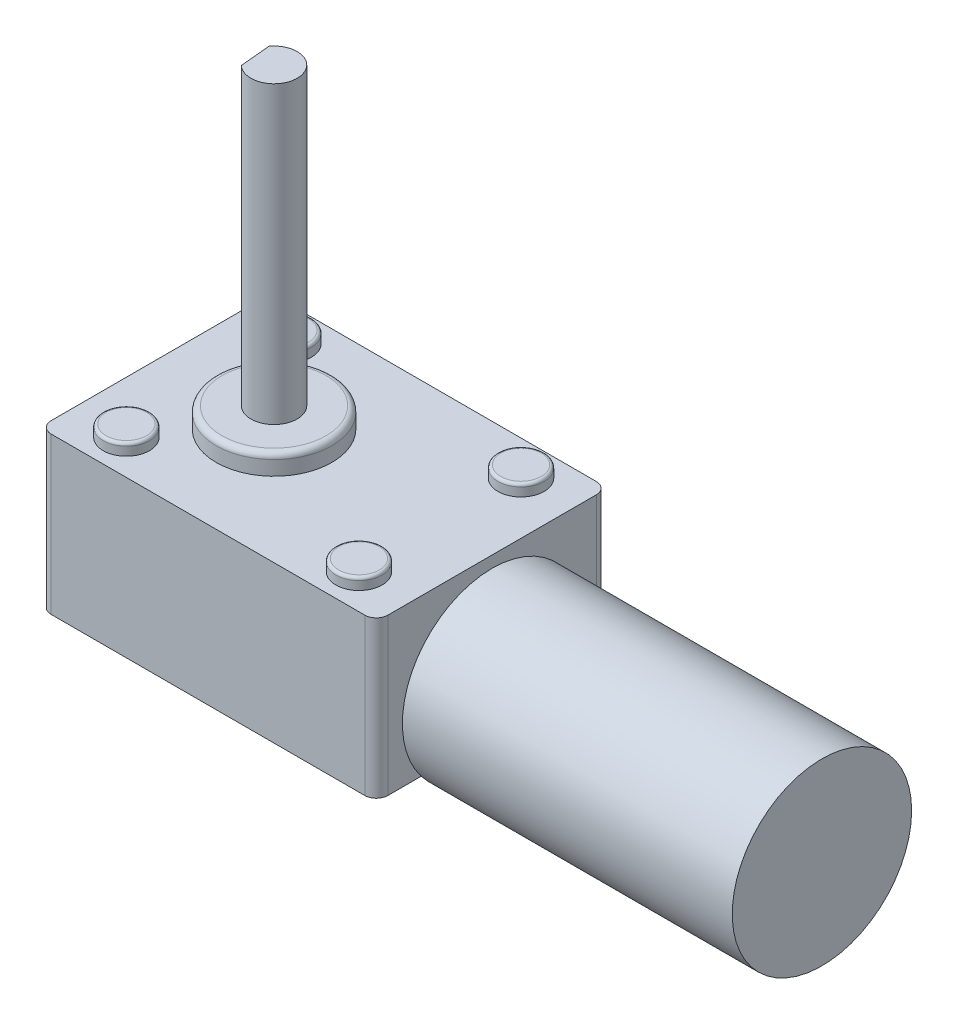
ISO-10303-21;
HEADER;
FILE_DESCRIPTION(('STEP AP214'),'2;1');
FILE_NAME('part.step','',(''),(''),'','','');
FILE_SCHEMA(('AUTOMOTIVE_DESIGN { 1 0 10303 214 1 1 1 1 }'));
ENDSEC;
DATA;
#1=APPLICATION_CONTEXT('core data for automotive mechanical design processes');
#2=APPLICATION_PROTOCOL_DEFINITION('international standard','automotive_design',2000,#1);
#3=PRODUCT_CONTEXT('',#1,'mechanical');
#4=PRODUCT('Part','Part','',(#3));
#5=PRODUCT_RELATED_PRODUCT_CATEGORY('part','',(#4));
#6=PRODUCT_DEFINITION_FORMATION('','',#4);
#7=PRODUCT_DEFINITION_CONTEXT('part definition',#1,'design');
#8=PRODUCT_DEFINITION('design','',#6,#7);
#9=PRODUCT_DEFINITION_SHAPE('','',#8);
#10=(LENGTH_UNIT() NAMED_UNIT(*) SI_UNIT(.MILLI.,.METRE.));
#11=(NAMED_UNIT(*) PLANE_ANGLE_UNIT() SI_UNIT($,.RADIAN.));
#12=(NAMED_UNIT(*) SI_UNIT($,.STERADIAN.) SOLID_ANGLE_UNIT());
#13=UNCERTAINTY_MEASURE_WITH_UNIT(LENGTH_MEASURE(1.E-05),#10,'distance_accuracy_value','');
#14=(GEOMETRIC_REPRESENTATION_CONTEXT(3) GLOBAL_UNCERTAINTY_ASSIGNED_CONTEXT((#13)) GLOBAL_UNIT_ASSIGNED_CONTEXT((#10,
#11,#12)) REPRESENTATION_CONTEXT('',''));
#15=CARTESIAN_POINT('',(0.,0.,0.));
#16=DIRECTION('',(0.,0.,1.));
#17=DIRECTION('',(1.,0.,0.));
#18=AXIS2_PLACEMENT_3D('',#15,#16,#17);
#19=CARTESIAN_POINT('',(-45.5299847726849,30.5,-6.12232558139533));
#20=DIRECTION('',(0.,1.,0.));
#21=DIRECTION('',(0.,0.,1.));
#22=AXIS2_PLACEMENT_3D('',#19,#20,#21);
#23=PLANE('',#22);
#24=CARTESIAN_POINT('',(-45.5299847726849,30.5,-6.12232558139533));
#25=DIRECTION('',(0.,1.,0.));
#26=DIRECTION('',(0.,0.,1.));
#27=AXIS2_PLACEMENT_3D('',#24,#25,#26);
#28=CIRCLE('',#27,9.);
#29=CARTESIAN_POINT('',(-45.5299847726849,30.5,2.87767441860467));
#30=VERTEX_POINT('',#29);
#31=EDGE_CURVE('E261',#30,#30,#28,.T.);
#32=ORIENTED_EDGE('',*,*,#31,.T.);
#33=EDGE_LOOP('',(#32));
#34=FACE_BOUND('',#33,.T.);
#35=DIRECTION('',(0.0931697826256463,0.,0.995650235577479));
#36=VECTOR('',#35,1.);
#37=CARTESIAN_POINT('',(-48.2704314048839,30.5,-3.20857331737752));
#38=LINE('',#37,#36);
#39=CARTESIAN_POINT('',(-48.7634395539507,30.5,-8.47705914965926));
#40=VERTEX_POINT('',#39);
#41=CARTESIAN_POINT('',(-48.2704314048839,30.5,-3.20857331737752));
#42=VERTEX_POINT('',#41);
#43=EDGE_CURVE('E132',#40,#42,#38,.T.);
#44=ORIENTED_EDGE('',*,*,#43,.F.);
#45=CARTESIAN_POINT('',(-45.5299847726849,30.5,-6.12232558139533));
#46=DIRECTION('',(0.,1.,0.));
#47=DIRECTION('',(0.,0.,1.));
#48=AXIS2_PLACEMENT_3D('',#45,#46,#47);
#49=CIRCLE('',#48,4.);
#50=EDGE_CURVE('E51',#42,#40,#49,.T.);
#51=ORIENTED_EDGE('',*,*,#50,.F.);
#52=EDGE_LOOP('',(#44,#51));
#53=FACE_BOUND('',#52,.T.);
#54=ADVANCED_FACE('F36',(#34,#53),#23,.T.);
#55=CARTESIAN_POINT('',(-66.0502325581395,27.,-26.1223255813953));
#56=DIRECTION('',(1.,0.,0.));
#57=DIRECTION('',(0.,0.,-1.));
#58=AXIS2_PLACEMENT_3D('',#55,#56,#57);
#59=PLANE('',#58);
#60=DIRECTION('',(0.,0.,1.));
#61=VECTOR('',#60,1.);
#62=CARTESIAN_POINT('',(-66.0502325581395,27.,-26.1223255813953));
#63=LINE('',#62,#61);
#64=CARTESIAN_POINT('',(-66.0502325581395,27.,-24.1223255813953));
#65=VERTEX_POINT('',#64);
#66=CARTESIAN_POINT('',(-66.0502325581395,27.,11.8776744186047));
#67=VERTEX_POINT('',#66);
#68=EDGE_CURVE('E177',#65,#67,#63,.T.);
#69=ORIENTED_EDGE('',*,*,#68,.F.);
#70=DIRECTION('',(0.,-1.,0.));
#71=VECTOR('',#70,1.);
#72=CARTESIAN_POINT('',(-66.0502325581395,27.,-24.1223255813953));
#73=LINE('',#72,#71);
#74=CARTESIAN_POINT('',(-66.0502325581395,0.,-24.1223255813953));
#75=VERTEX_POINT('',#74);
#76=EDGE_CURVE('E229',#65,#75,#73,.T.);
#77=ORIENTED_EDGE('',*,*,#76,.T.);
#78=DIRECTION('',(0.,0.,1.));
#79=VECTOR('',#78,1.);
#80=CARTESIAN_POINT('',(-66.0502325581395,0.,-26.1223255813953));
#81=LINE('',#80,#79);
#82=CARTESIAN_POINT('',(-66.0502325581395,0.,11.8776744186047));
#83=VERTEX_POINT('',#82);
#84=EDGE_CURVE('E173',#75,#83,#81,.T.);
#85=ORIENTED_EDGE('',*,*,#84,.T.);
#86=DIRECTION('',(0.,-1.,0.));
#87=VECTOR('',#86,1.);
#88=CARTESIAN_POINT('',(-66.0502325581395,27.,11.8776744186047));
#89=LINE('',#88,#87);
#90=EDGE_CURVE('E227',#83,#67,#89,.F.);
#91=ORIENTED_EDGE('',*,*,#90,.T.);
#92=EDGE_LOOP('',(#69,#77,#85,#91));
#93=FACE_BOUND('',#92,.T.);
#94=ADVANCED_FACE('F308',(#93),#59,.F.);
#95=CARTESIAN_POINT('',(-66.0502325581395,27.,13.8776744186047));
#96=DIRECTION('',(0.,0.,-1.));
#97=DIRECTION('',(-1.,0.,0.));
#98=AXIS2_PLACEMENT_3D('',#95,#96,#97);
#99=PLANE('',#98);
#100=DIRECTION('',(1.,0.,0.));
#101=VECTOR('',#100,1.);
#102=CARTESIAN_POINT('',(-66.0502325581395,27.,13.8776744186047));
#103=LINE('',#102,#101);
#104=CARTESIAN_POINT('',(-64.0502325581395,27.,13.8776744186047));
#105=VERTEX_POINT('',#104);
#106=CARTESIAN_POINT('',(-9.85023255813951,27.,13.8776744186047));
#107=VERTEX_POINT('',#106);
#108=EDGE_CURVE('E180',#105,#107,#103,.T.);
#109=ORIENTED_EDGE('',*,*,#108,.F.);
#110=DIRECTION('',(0.,-1.,0.));
#111=VECTOR('',#110,1.);
#112=CARTESIAN_POINT('',(-64.0502325581395,27.,13.8776744186047));
#113=LINE('',#112,#111);
#114=CARTESIAN_POINT('',(-64.0502325581395,0.,13.8776744186047));
#115=VERTEX_POINT('',#114);
#116=EDGE_CURVE('E234',#105,#115,#113,.T.);
#117=ORIENTED_EDGE('',*,*,#116,.T.);
#118=DIRECTION('',(1.,0.,0.));
#119=VECTOR('',#118,1.);
#120=CARTESIAN_POINT('',(-66.0502325581395,0.,13.8776744186047));
#121=LINE('',#120,#119);
#122=CARTESIAN_POINT('',(-9.85023255813951,0.,13.8776744186047));
#123=VERTEX_POINT('',#122);
#124=EDGE_CURVE('E193',#115,#123,#121,.T.);
#125=ORIENTED_EDGE('',*,*,#124,.T.);
#126=DIRECTION('',(0.,-1.,0.));
#127=VECTOR('',#126,1.);
#128=CARTESIAN_POINT('',(-9.85023255813951,27.,13.8776744186047));
#129=LINE('',#128,#127);
#130=EDGE_CURVE('E232',#123,#107,#129,.F.);
#131=ORIENTED_EDGE('',*,*,#130,.T.);
#132=EDGE_LOOP('',(#109,#117,#125,#131));
#133=FACE_BOUND('',#132,.T.);
#134=ADVANCED_FACE('F314',(#133),#99,.F.);
#135=CARTESIAN_POINT('',(-7.85023255813951,27.,-26.1223255813953));
#136=DIRECTION('',(-1.,0.,0.));
#137=DIRECTION('',(0.,0.,1.));
#138=AXIS2_PLACEMENT_3D('',#135,#136,#137);
#139=PLANE('',#138);
#140=CARTESIAN_POINT('',(-7.85023255813951,9.5,-6.12232558139533));
#141=DIRECTION('',(1.,0.,0.));
#142=DIRECTION('',(0.,0.,-1.));
#143=AXIS2_PLACEMENT_3D('',#140,#141,#142);
#144=CIRCLE('',#143,15.5);
#145=CARTESIAN_POINT('',(-7.85023255813951,0.,-18.3697742953112));
#146=VERTEX_POINT('',#145);
#147=CARTESIAN_POINT('',(-7.85023255813951,0.,6.12512313252055));
#148=VERTEX_POINT('',#147);
#149=EDGE_CURVE('E169',#146,#148,#144,.T.);
#150=ORIENTED_EDGE('',*,*,#149,.F.);
#151=DIRECTION('',(0.,0.,-1.));
#152=VECTOR('',#151,1.);
#153=CARTESIAN_POINT('',(-7.85023255813951,0.,-26.1223255813953));
#154=LINE('',#153,#152);
#155=CARTESIAN_POINT('',(-7.85023255813951,0.,-24.1223255813953));
#156=VERTEX_POINT('',#155);
#157=EDGE_CURVE('E196',#146,#156,#154,.T.);
#158=ORIENTED_EDGE('',*,*,#157,.T.);
#159=DIRECTION('',(0.,-1.,0.));
#160=VECTOR('',#159,1.);
#161=CARTESIAN_POINT('',(-7.85023255813951,27.,-24.1223255813953));
#162=LINE('',#161,#160);
#163=CARTESIAN_POINT('',(-7.85023255813951,27.,-24.1223255813953));
#164=VERTEX_POINT('',#163);
#165=EDGE_CURVE('E217',#156,#164,#162,.F.);
#166=ORIENTED_EDGE('',*,*,#165,.T.);
#167=DIRECTION('',(0.,0.,-1.));
#168=VECTOR('',#167,1.);
#169=CARTESIAN_POINT('',(-7.85023255813951,27.,-26.1223255813953));
#170=LINE('',#169,#168);
#171=CARTESIAN_POINT('',(-7.85023255813951,27.,11.8776744186047));
#172=VERTEX_POINT('',#171);
#173=EDGE_CURVE('E184',#172,#164,#170,.T.);
#174=ORIENTED_EDGE('',*,*,#173,.F.);
#175=DIRECTION('',(0.,-1.,0.));
#176=VECTOR('',#175,1.);
#177=CARTESIAN_POINT('',(-7.85023255813951,27.,11.8776744186047));
#178=LINE('',#177,#176);
#179=CARTESIAN_POINT('',(-7.85023255813951,0.,11.8776744186047));
#180=VERTEX_POINT('',#179);
#181=EDGE_CURVE('E214',#172,#180,#178,.T.);
#182=ORIENTED_EDGE('',*,*,#181,.T.);
#183=EDGE_CURVE('E197',#180,#148,#154,.T.);
#184=ORIENTED_EDGE('',*,*,#183,.T.);
#185=EDGE_LOOP('',(#150,#158,#166,#174,#182,#184));
#186=FACE_BOUND('',#185,.T.);
#187=ADVANCED_FACE('F383',(#186),#139,.F.);
#188=CARTESIAN_POINT('',(-66.0502325581395,27.,-26.1223255813953));
#189=DIRECTION('',(0.,0.,1.));
#190=DIRECTION('',(1.,0.,0.));
#191=AXIS2_PLACEMENT_3D('',#188,#189,#190);
#192=PLANE('',#191);
#193=DIRECTION('',(-1.,0.,0.));
#194=VECTOR('',#193,1.);
#195=CARTESIAN_POINT('',(-66.0502325581395,27.,-26.1223255813953));
#196=LINE('',#195,#194);
#197=CARTESIAN_POINT('',(-9.85023255813953,27.,-26.1223255813953));
#198=VERTEX_POINT('',#197);
#199=CARTESIAN_POINT('',(-64.0502325581395,27.,-26.1223255813953));
#200=VERTEX_POINT('',#199);
#201=EDGE_CURVE('E187',#198,#200,#196,.T.);
#202=ORIENTED_EDGE('',*,*,#201,.F.);
#203=DIRECTION('',(0.,-1.,0.));
#204=VECTOR('',#203,1.);
#205=CARTESIAN_POINT('',(-9.85023255813951,27.,-26.1223255813953));
#206=LINE('',#205,#204);
#207=CARTESIAN_POINT('',(-9.85023255813953,0.,-26.1223255813953));
#208=VERTEX_POINT('',#207);
#209=EDGE_CURVE('E202',#198,#208,#206,.T.);
#210=ORIENTED_EDGE('',*,*,#209,.T.);
#211=DIRECTION('',(-1.,0.,0.));
#212=VECTOR('',#211,1.);
#213=CARTESIAN_POINT('',(-66.0502325581395,0.,-26.1223255813953));
#214=LINE('',#213,#212);
#215=CARTESIAN_POINT('',(-64.0502325581395,0.,-26.1223255813953));
#216=VERTEX_POINT('',#215);
#217=EDGE_CURVE('E181',#208,#216,#214,.T.);
#218=ORIENTED_EDGE('',*,*,#217,.T.);
#219=DIRECTION('',(0.,-1.,0.));
#220=VECTOR('',#219,1.);
#221=CARTESIAN_POINT('',(-64.0502325581395,27.,-26.1223255813953));
#222=LINE('',#221,#220);
#223=EDGE_CURVE('E190',#216,#200,#222,.F.);
#224=ORIENTED_EDGE('',*,*,#223,.T.);
#225=EDGE_LOOP('',(#202,#210,#218,#224));
#226=FACE_BOUND('',#225,.T.);
#227=ADVANCED_FACE('F375',(#226),#192,.F.);
#228=CARTESIAN_POINT('',(0.,27.,0.));
#229=DIRECTION('',(0.,1.,0.));
#230=DIRECTION('',(0.,0.,1.));
#231=AXIS2_PLACEMENT_3D('',#228,#229,#230);
#232=PLANE('',#231);
#233=CARTESIAN_POINT('',(-45.5299847726849,27.,-6.12232558139533));
#234=DIRECTION('',(0.,1.,0.));
#235=DIRECTION('',(0.,0.,1.));
#236=AXIS2_PLACEMENT_3D('',#233,#234,#235);
#237=CIRCLE('',#236,10.);
#238=CARTESIAN_POINT('',(-45.5299847726849,27.,3.87767441860467));
#239=VERTEX_POINT('',#238);
#240=EDGE_CURVE('E154',#239,#239,#237,.T.);
#241=ORIENTED_EDGE('',*,*,#240,.F.);
#242=EDGE_LOOP('',(#241));
#243=FACE_BOUND('',#242,.T.);
#244=CARTESIAN_POINT('',(-57.0502325581395,27.,-20.1223255813953));
#245=DIRECTION('',(0.,1.,0.));
#246=DIRECTION('',(0.,0.,1.));
#247=AXIS2_PLACEMENT_3D('',#244,#245,#246);
#248=CIRCLE('',#247,4.);
#249=CARTESIAN_POINT('',(-57.0502325581395,27.,-16.1223255813953));
#250=VERTEX_POINT('',#249);
#251=EDGE_CURVE('E157',#250,#250,#248,.T.);
#252=ORIENTED_EDGE('',*,*,#251,.F.);
#253=EDGE_LOOP('',(#252));
#254=FACE_BOUND('',#253,.T.);
#255=CARTESIAN_POINT('',(-57.0502325581395,27.,7.87767441860467));
#256=DIRECTION('',(0.,1.,0.));
#257=DIRECTION('',(0.,0.,1.));
#258=AXIS2_PLACEMENT_3D('',#255,#256,#257);
#259=CIRCLE('',#258,4.);
#260=CARTESIAN_POINT('',(-57.0502325581395,27.,11.8776744186047));
#261=VERTEX_POINT('',#260);
#262=EDGE_CURVE('E160',#261,#261,#259,.T.);
#263=ORIENTED_EDGE('',*,*,#262,.F.);
#264=EDGE_LOOP('',(#263));
#265=FACE_BOUND('',#264,.T.);
#266=CARTESIAN_POINT('',(-16.8502325581395,27.,-20.1223255813953));
#267=DIRECTION('',(0.,1.,0.));
#268=DIRECTION('',(0.,0.,1.));
#269=AXIS2_PLACEMENT_3D('',#266,#267,#268);
#270=CIRCLE('',#269,4.);
#271=CARTESIAN_POINT('',(-16.8502325581395,27.,-16.1223255813953));
#272=VERTEX_POINT('',#271);
#273=EDGE_CURVE('E163',#272,#272,#270,.T.);
#274=ORIENTED_EDGE('',*,*,#273,.F.);
#275=EDGE_LOOP('',(#274));
#276=FACE_BOUND('',#275,.T.);
#277=CARTESIAN_POINT('',(-16.8502325581395,27.,7.87767441860467));
#278=DIRECTION('',(0.,1.,0.));
#279=DIRECTION('',(0.,0.,1.));
#280=AXIS2_PLACEMENT_3D('',#277,#278,#279);
#281=CIRCLE('',#280,4.);
#282=CARTESIAN_POINT('',(-16.8502325581395,27.,11.8776744186047));
#283=VERTEX_POINT('',#282);
#284=EDGE_CURVE('E166',#283,#283,#281,.T.);
#285=ORIENTED_EDGE('',*,*,#284,.F.);
#286=EDGE_LOOP('',(#285));
#287=FACE_BOUND('',#286,.T.);
#288=ORIENTED_EDGE('',*,*,#173,.T.);
#289=CARTESIAN_POINT('',(-9.85023255813951,27.,-24.1223255813953));
#290=DIRECTION('',(0.,1.,0.));
#291=DIRECTION('',(0.,0.,1.));
#292=AXIS2_PLACEMENT_3D('',#289,#290,#291);
#293=CIRCLE('',#292,2.);
#294=EDGE_CURVE('E225',#164,#198,#293,.T.);
#295=ORIENTED_EDGE('',*,*,#294,.T.);
#296=ORIENTED_EDGE('',*,*,#201,.T.);
#297=CARTESIAN_POINT('',(-64.0502325581395,27.,-24.1223255813953));
#298=DIRECTION('',(0.,1.,0.));
#299=DIRECTION('',(0.,0.,1.));
#300=AXIS2_PLACEMENT_3D('',#297,#298,#299);
#301=CIRCLE('',#300,2.);
#302=EDGE_CURVE('E223',#200,#65,#301,.T.);
#303=ORIENTED_EDGE('',*,*,#302,.T.);
#304=ORIENTED_EDGE('',*,*,#68,.T.);
#305=CARTESIAN_POINT('',(-64.0502325581395,27.,11.8776744186047));
#306=DIRECTION('',(0.,1.,0.));
#307=DIRECTION('',(0.,0.,1.));
#308=AXIS2_PLACEMENT_3D('',#305,#306,#307);
#309=CIRCLE('',#308,2.);
#310=EDGE_CURVE('E221',#67,#105,#309,.T.);
#311=ORIENTED_EDGE('',*,*,#310,.T.);
#312=ORIENTED_EDGE('',*,*,#108,.T.);
#313=CARTESIAN_POINT('',(-9.85023255813951,27.,11.8776744186047));
#314=DIRECTION('',(0.,1.,0.));
#315=DIRECTION('',(0.,0.,1.));
#316=AXIS2_PLACEMENT_3D('',#313,#314,#315);
#317=CIRCLE('',#316,2.);
#318=EDGE_CURVE('E219',#107,#172,#317,.T.);
#319=ORIENTED_EDGE('',*,*,#318,.T.);
#320=EDGE_LOOP('',(#288,#295,#296,#303,#304,#311,#312,#319));
#321=FACE_BOUND('',#320,.T.);
#322=ADVANCED_FACE('F371',(#243,#254,#265,#276,#287,#321),#232,.T.);
#323=CARTESIAN_POINT('',(0.,0.,0.));
#324=DIRECTION('',(0.,1.,0.));
#325=DIRECTION('',(0.,0.,1.));
#326=AXIS2_PLACEMENT_3D('',#323,#324,#325);
#327=PLANE('',#326);
#328=CARTESIAN_POINT('',(-45.5299847726849,0.,-6.12232558139533));
#329=DIRECTION('',(0.,1.,0.));
#330=DIRECTION('',(0.,0.,1.));
#331=AXIS2_PLACEMENT_3D('',#328,#329,#330);
#332=CIRCLE('',#331,10.);
#333=CARTESIAN_POINT('',(-45.5299847726849,0.,3.87767441860467));
#334=VERTEX_POINT('',#333);
#335=EDGE_CURVE('E135',#334,#334,#332,.T.);
#336=ORIENTED_EDGE('',*,*,#335,.T.);
#337=EDGE_LOOP('',(#336));
#338=FACE_BOUND('',#337,.T.);
#339=CARTESIAN_POINT('',(-57.0502325581395,0.,-20.1223255813953));
#340=DIRECTION('',(0.,1.,0.));
#341=DIRECTION('',(0.,0.,1.));
#342=AXIS2_PLACEMENT_3D('',#339,#340,#341);
#343=CIRCLE('',#342,4.);
#344=CARTESIAN_POINT('',(-57.0502325581395,0.,-16.1223255813953));
#345=VERTEX_POINT('',#344);
#346=EDGE_CURVE('E138',#345,#345,#343,.T.);
#347=ORIENTED_EDGE('',*,*,#346,.T.);
#348=EDGE_LOOP('',(#347));
#349=FACE_BOUND('',#348,.T.);
#350=CARTESIAN_POINT('',(-57.0502325581395,0.,7.87767441860467));
#351=DIRECTION('',(0.,1.,0.));
#352=DIRECTION('',(0.,0.,1.));
#353=AXIS2_PLACEMENT_3D('',#350,#351,#352);
#354=CIRCLE('',#353,4.);
#355=CARTESIAN_POINT('',(-57.0502325581395,0.,11.8776744186047));
#356=VERTEX_POINT('',#355);
#357=EDGE_CURVE('E145',#356,#356,#354,.T.);
#358=ORIENTED_EDGE('',*,*,#357,.T.);
#359=EDGE_LOOP('',(#358));
#360=FACE_BOUND('',#359,.T.);
#361=CARTESIAN_POINT('',(-16.8502325581395,0.,-20.1223255813953));
#362=DIRECTION('',(0.,1.,0.));
#363=DIRECTION('',(0.,0.,1.));
#364=AXIS2_PLACEMENT_3D('',#361,#362,#363);
#365=CIRCLE('',#364,4.);
#366=CARTESIAN_POINT('',(-16.8502325581395,0.,-16.1223255813953));
#367=VERTEX_POINT('',#366);
#368=EDGE_CURVE('E148',#367,#367,#365,.T.);
#369=ORIENTED_EDGE('',*,*,#368,.T.);
#370=EDGE_LOOP('',(#369));
#371=FACE_BOUND('',#370,.T.);
#372=CARTESIAN_POINT('',(-16.8502325581395,0.,7.87767441860467));
#373=DIRECTION('',(0.,1.,0.));
#374=DIRECTION('',(0.,0.,1.));
#375=AXIS2_PLACEMENT_3D('',#372,#373,#374);
#376=CIRCLE('',#375,4.);
#377=CARTESIAN_POINT('',(-16.8502325581395,0.,11.8776744186047));
#378=VERTEX_POINT('',#377);
#379=EDGE_CURVE('E151',#378,#378,#376,.T.);
#380=ORIENTED_EDGE('',*,*,#379,.T.);
#381=EDGE_LOOP('',(#380));
#382=FACE_BOUND('',#381,.T.);
#383=ORIENTED_EDGE('',*,*,#217,.F.);
#384=CARTESIAN_POINT('',(-9.85023255813951,0.,-24.1223255813953));
#385=DIRECTION('',(0.,1.,0.));
#386=DIRECTION('',(0.,0.,1.));
#387=AXIS2_PLACEMENT_3D('',#384,#385,#386);
#388=CIRCLE('',#387,2.);
#389=EDGE_CURVE('E211',#208,#156,#388,.F.);
#390=ORIENTED_EDGE('',*,*,#389,.T.);
#391=ORIENTED_EDGE('',*,*,#157,.F.);
#392=EDGE_CURVE('E59',#148,#146,#154,.T.);
#393=ORIENTED_EDGE('',*,*,#392,.F.);
#394=ORIENTED_EDGE('',*,*,#183,.F.);
#395=CARTESIAN_POINT('',(-9.85023255813951,0.,11.8776744186047));
#396=DIRECTION('',(0.,1.,0.));
#397=DIRECTION('',(0.,0.,1.));
#398=AXIS2_PLACEMENT_3D('',#395,#396,#397);
#399=CIRCLE('',#398,2.);
#400=EDGE_CURVE('E205',#180,#123,#399,.F.);
#401=ORIENTED_EDGE('',*,*,#400,.T.);
#402=ORIENTED_EDGE('',*,*,#124,.F.);
#403=CARTESIAN_POINT('',(-64.0502325581395,0.,11.8776744186047));
#404=DIRECTION('',(0.,1.,0.));
#405=DIRECTION('',(0.,0.,1.));
#406=AXIS2_PLACEMENT_3D('',#403,#404,#405);
#407=CIRCLE('',#406,2.);
#408=EDGE_CURVE('E207',#115,#83,#407,.F.);
#409=ORIENTED_EDGE('',*,*,#408,.T.);
#410=ORIENTED_EDGE('',*,*,#84,.F.);
#411=CARTESIAN_POINT('',(-64.0502325581395,0.,-24.1223255813953));
#412=DIRECTION('',(0.,1.,0.));
#413=DIRECTION('',(0.,0.,1.));
#414=AXIS2_PLACEMENT_3D('',#411,#412,#413);
#415=CIRCLE('',#414,2.);
#416=EDGE_CURVE('E209',#75,#216,#415,.F.);
#417=ORIENTED_EDGE('',*,*,#416,.T.);
#418=EDGE_LOOP('',(#383,#390,#391,#393,#394,#401,#402,#409,#410,#417));
#419=FACE_BOUND('',#418,.T.);
#420=ADVANCED_FACE('F374',(#338,#349,#360,#371,#382,#419),#327,.F.);
#421=CARTESIAN_POINT('',(-9.85023255813951,27.,-24.1223255813953));
#422=DIRECTION('',(0.,-1.,0.));
#423=DIRECTION('',(0.,0.,-1.));
#424=AXIS2_PLACEMENT_3D('',#421,#422,#423);
#425=CYLINDRICAL_SURFACE('',#424,2.);
#426=ORIENTED_EDGE('',*,*,#294,.F.);
#427=ORIENTED_EDGE('',*,*,#165,.F.);
#428=ORIENTED_EDGE('',*,*,#389,.F.);
#429=ORIENTED_EDGE('',*,*,#209,.F.);
#430=EDGE_LOOP('',(#426,#427,#428,#429));
#431=FACE_BOUND('',#430,.T.);
#432=ADVANCED_FACE('F379',(#431),#425,.T.);
#433=CARTESIAN_POINT('',(-64.0502325581395,27.,-24.1223255813953));
#434=DIRECTION('',(0.,-1.,0.));
#435=DIRECTION('',(0.,0.,-1.));
#436=AXIS2_PLACEMENT_3D('',#433,#434,#435);
#437=CYLINDRICAL_SURFACE('',#436,2.);
#438=ORIENTED_EDGE('',*,*,#302,.F.);
#439=ORIENTED_EDGE('',*,*,#223,.F.);
#440=ORIENTED_EDGE('',*,*,#416,.F.);
#441=ORIENTED_EDGE('',*,*,#76,.F.);
#442=EDGE_LOOP('',(#438,#439,#440,#441));
#443=FACE_BOUND('',#442,.T.);
#444=ADVANCED_FACE('F393',(#443),#437,.T.);
#445=CARTESIAN_POINT('',(-64.0502325581395,27.,11.8776744186047));
#446=DIRECTION('',(0.,-1.,0.));
#447=DIRECTION('',(0.,0.,-1.));
#448=AXIS2_PLACEMENT_3D('',#445,#446,#447);
#449=CYLINDRICAL_SURFACE('',#448,2.);
#450=ORIENTED_EDGE('',*,*,#310,.F.);
#451=ORIENTED_EDGE('',*,*,#90,.F.);
#452=ORIENTED_EDGE('',*,*,#408,.F.);
#453=ORIENTED_EDGE('',*,*,#116,.F.);
#454=EDGE_LOOP('',(#450,#451,#452,#453));
#455=FACE_BOUND('',#454,.T.);
#456=ADVANCED_FACE('F397',(#455),#449,.T.);
#457=CARTESIAN_POINT('',(-9.85023255813951,27.,11.8776744186047));
#458=DIRECTION('',(0.,-1.,0.));
#459=DIRECTION('',(0.,0.,-1.));
#460=AXIS2_PLACEMENT_3D('',#457,#458,#459);
#461=CYLINDRICAL_SURFACE('',#460,2.);
#462=ORIENTED_EDGE('',*,*,#318,.F.);
#463=ORIENTED_EDGE('',*,*,#130,.F.);
#464=ORIENTED_EDGE('',*,*,#400,.F.);
#465=ORIENTED_EDGE('',*,*,#181,.F.);
#466=EDGE_LOOP('',(#462,#463,#464,#465));
#467=FACE_BOUND('',#466,.T.);
#468=ADVANCED_FACE('F366',(#467),#461,.T.);
#469=CARTESIAN_POINT('',(-7.85023255813951,9.5,-6.12232558139533));
#470=DIRECTION('',(1.,0.,0.));
#471=DIRECTION('',(0.,0.,-1.));
#472=AXIS2_PLACEMENT_3D('',#469,#470,#471);
#473=PLANE('',#472);
#474=EDGE_CURVE('E174',#148,#146,#144,.T.);
#475=ORIENTED_EDGE('',*,*,#474,.F.);
#476=ORIENTED_EDGE('',*,*,#392,.T.);
#477=EDGE_LOOP('',(#475,#476));
#478=FACE_BOUND('',#477,.T.);
#479=ADVANCED_FACE('F363',(#478),#473,.F.);
#480=CARTESIAN_POINT('',(49.1497674418605,9.5,-6.12232558139534));
#481=DIRECTION('',(-1.,0.,0.));
#482=DIRECTION('',(0.,0.,1.));
#483=AXIS2_PLACEMENT_3D('',#480,#481,#482);
#484=CYLINDRICAL_SURFACE('',#483,15.5);
#485=CARTESIAN_POINT('',(49.1497674418605,9.5,-6.12232558139534));
#486=DIRECTION('',(1.,0.,0.));
#487=DIRECTION('',(0.,0.,-1.));
#488=AXIS2_PLACEMENT_3D('',#485,#486,#487);
#489=CIRCLE('',#488,15.5);
#490=CARTESIAN_POINT('',(49.1497674418605,9.5,-21.6223255813953));
#491=VERTEX_POINT('',#490);
#492=EDGE_CURVE('E170',#491,#491,#489,.T.);
#493=ORIENTED_EDGE('',*,*,#492,.F.);
#494=EDGE_LOOP('',(#493));
#495=FACE_BOUND('',#494,.T.);
#496=ORIENTED_EDGE('',*,*,#474,.T.);
#497=ORIENTED_EDGE('',*,*,#149,.T.);
#498=EDGE_LOOP('',(#496,#497));
#499=FACE_BOUND('',#498,.T.);
#500=ADVANCED_FACE('F361',(#495,#499),#484,.T.);
#501=CARTESIAN_POINT('',(49.1497674418605,9.5,-6.12232558139534));
#502=DIRECTION('',(1.,0.,0.));
#503=DIRECTION('',(0.,0.,-1.));
#504=AXIS2_PLACEMENT_3D('',#501,#502,#503);
#505=PLANE('',#504);
#506=ORIENTED_EDGE('',*,*,#492,.T.);
#507=EDGE_LOOP('',(#506));
#508=FACE_BOUND('',#507,.T.);
#509=ADVANCED_FACE('F357',(#508),#505,.T.);
#510=CARTESIAN_POINT('',(-16.8502325581395,29.,7.87767441860467));
#511=DIRECTION('',(0.,-1.,0.));
#512=DIRECTION('',(0.,0.,-1.));
#513=AXIS2_PLACEMENT_3D('',#510,#511,#512);
#514=CYLINDRICAL_SURFACE('',#513,4.);
#515=CARTESIAN_POINT('',(-16.8502325581395,28.5,7.87767441860467));
#516=DIRECTION('',(0.,1.,0.));
#517=DIRECTION('',(0.,0.,1.));
#518=AXIS2_PLACEMENT_3D('',#515,#516,#517);
#519=CIRCLE('',#518,4.);
#520=CARTESIAN_POINT('',(-16.8502325581395,28.5,11.8776744186047));
#521=VERTEX_POINT('',#520);
#522=EDGE_CURVE('E258',#521,#521,#519,.F.);
#523=ORIENTED_EDGE('',*,*,#522,.T.);
#524=EDGE_LOOP('',(#523));
#525=FACE_BOUND('',#524,.T.);
#526=ORIENTED_EDGE('',*,*,#284,.T.);
#527=EDGE_LOOP('',(#526));
#528=FACE_BOUND('',#527,.T.);
#529=ADVANCED_FACE('F353',(#525,#528),#514,.T.);
#530=CARTESIAN_POINT('',(-16.8502325581395,29.,7.87767441860467));
#531=DIRECTION('',(0.,1.,0.));
#532=DIRECTION('',(0.,0.,1.));
#533=AXIS2_PLACEMENT_3D('',#530,#531,#532);
#534=PLANE('',#533);
#535=CARTESIAN_POINT('',(-16.8502325581395,29.,7.87767441860467));
#536=DIRECTION('',(0.,1.,0.));
#537=DIRECTION('',(0.,0.,1.));
#538=AXIS2_PLACEMENT_3D('',#535,#536,#537);
#539=CIRCLE('',#538,3.5);
#540=CARTESIAN_POINT('',(-16.8502325581395,29.,11.3776744186047));
#541=VERTEX_POINT('',#540);
#542=EDGE_CURVE('E255',#541,#541,#539,.T.);
#543=ORIENTED_EDGE('',*,*,#542,.T.);
#544=EDGE_LOOP('',(#543));
#545=FACE_BOUND('',#544,.T.);
#546=ADVANCED_FACE('F349',(#545),#534,.T.);
#547=CARTESIAN_POINT('',(-16.8502325581395,29.,-20.1223255813953));
#548=DIRECTION('',(0.,-1.,0.));
#549=DIRECTION('',(0.,0.,-1.));
#550=AXIS2_PLACEMENT_3D('',#547,#548,#549);
#551=CYLINDRICAL_SURFACE('',#550,4.);
#552=CARTESIAN_POINT('',(-16.8502325581395,28.5,-20.1223255813953));
#553=DIRECTION('',(0.,1.,0.));
#554=DIRECTION('',(0.,0.,1.));
#555=AXIS2_PLACEMENT_3D('',#552,#553,#554);
#556=CIRCLE('',#555,4.);
#557=CARTESIAN_POINT('',(-16.8502325581395,28.5,-16.1223255813953));
#558=VERTEX_POINT('',#557);
#559=EDGE_CURVE('E252',#558,#558,#556,.F.);
#560=ORIENTED_EDGE('',*,*,#559,.T.);
#561=EDGE_LOOP('',(#560));
#562=FACE_BOUND('',#561,.T.);
#563=ORIENTED_EDGE('',*,*,#273,.T.);
#564=EDGE_LOOP('',(#563));
#565=FACE_BOUND('',#564,.T.);
#566=ADVANCED_FACE('F345',(#562,#565),#551,.T.);
#567=CARTESIAN_POINT('',(-16.8502325581395,29.,-20.1223255813953));
#568=DIRECTION('',(0.,1.,0.));
#569=DIRECTION('',(0.,0.,1.));
#570=AXIS2_PLACEMENT_3D('',#567,#568,#569);
#571=PLANE('',#570);
#572=CARTESIAN_POINT('',(-16.8502325581395,29.,-20.1223255813953));
#573=DIRECTION('',(0.,1.,0.));
#574=DIRECTION('',(0.,0.,1.));
#575=AXIS2_PLACEMENT_3D('',#572,#573,#574);
#576=CIRCLE('',#575,3.5);
#577=CARTESIAN_POINT('',(-16.8502325581395,29.,-16.6223255813953));
#578=VERTEX_POINT('',#577);
#579=EDGE_CURVE('E249',#578,#578,#576,.T.);
#580=ORIENTED_EDGE('',*,*,#579,.T.);
#581=EDGE_LOOP('',(#580));
#582=FACE_BOUND('',#581,.T.);
#583=ADVANCED_FACE('F341',(#582),#571,.T.);
#584=CARTESIAN_POINT('',(-57.0502325581395,29.,7.87767441860467));
#585=DIRECTION('',(0.,-1.,0.));
#586=DIRECTION('',(0.,0.,-1.));
#587=AXIS2_PLACEMENT_3D('',#584,#585,#586);
#588=CYLINDRICAL_SURFACE('',#587,4.);
#589=CARTESIAN_POINT('',(-57.0502325581395,28.5,7.87767441860467));
#590=DIRECTION('',(0.,1.,0.));
#591=DIRECTION('',(0.,0.,1.));
#592=AXIS2_PLACEMENT_3D('',#589,#590,#591);
#593=CIRCLE('',#592,4.);
#594=CARTESIAN_POINT('',(-57.0502325581395,28.5,11.8776744186047));
#595=VERTEX_POINT('',#594);
#596=EDGE_CURVE('E240',#595,#595,#593,.F.);
#597=ORIENTED_EDGE('',*,*,#596,.T.);
#598=EDGE_LOOP('',(#597));
#599=FACE_BOUND('',#598,.T.);
#600=ORIENTED_EDGE('',*,*,#262,.T.);
#601=EDGE_LOOP('',(#600));
#602=FACE_BOUND('',#601,.T.);
#603=ADVANCED_FACE('F337',(#599,#602),#588,.T.);
#604=CARTESIAN_POINT('',(-57.0502325581395,29.,7.87767441860467));
#605=DIRECTION('',(0.,1.,0.));
#606=DIRECTION('',(0.,0.,1.));
#607=AXIS2_PLACEMENT_3D('',#604,#605,#606);
#608=PLANE('',#607);
#609=CARTESIAN_POINT('',(-57.0502325581395,29.,7.87767441860467));
#610=DIRECTION('',(0.,1.,0.));
#611=DIRECTION('',(0.,0.,1.));
#612=AXIS2_PLACEMENT_3D('',#609,#610,#611);
#613=CIRCLE('',#612,3.5);
#614=CARTESIAN_POINT('',(-57.0502325581395,29.,11.3776744186047));
#615=VERTEX_POINT('',#614);
#616=EDGE_CURVE('E237',#615,#615,#613,.T.);
#617=ORIENTED_EDGE('',*,*,#616,.T.);
#618=EDGE_LOOP('',(#617));
#619=FACE_BOUND('',#618,.T.);
#620=ADVANCED_FACE('F333',(#619),#608,.T.);
#621=CARTESIAN_POINT('',(-57.0502325581395,29.,-20.1223255813953));
#622=DIRECTION('',(0.,-1.,0.));
#623=DIRECTION('',(0.,0.,-1.));
#624=AXIS2_PLACEMENT_3D('',#621,#622,#623);
#625=CYLINDRICAL_SURFACE('',#624,4.);
#626=CARTESIAN_POINT('',(-57.0502325581395,28.5,-20.1223255813953));
#627=DIRECTION('',(0.,1.,0.));
#628=DIRECTION('',(0.,0.,1.));
#629=AXIS2_PLACEMENT_3D('',#626,#627,#628);
#630=CIRCLE('',#629,4.);
#631=CARTESIAN_POINT('',(-57.0502325581395,28.5,-16.1223255813953));
#632=VERTEX_POINT('',#631);
#633=EDGE_CURVE('E246',#632,#632,#630,.F.);
#634=ORIENTED_EDGE('',*,*,#633,.T.);
#635=EDGE_LOOP('',(#634));
#636=FACE_BOUND('',#635,.T.);
#637=ORIENTED_EDGE('',*,*,#251,.T.);
#638=EDGE_LOOP('',(#637));
#639=FACE_BOUND('',#638,.T.);
#640=ADVANCED_FACE('F329',(#636,#639),#625,.T.);
#641=CARTESIAN_POINT('',(-57.0502325581395,29.,-20.1223255813953));
#642=DIRECTION('',(0.,1.,0.));
#643=DIRECTION('',(0.,0.,1.));
#644=AXIS2_PLACEMENT_3D('',#641,#642,#643);
#645=PLANE('',#644);
#646=CARTESIAN_POINT('',(-57.0502325581395,29.,-20.1223255813953));
#647=DIRECTION('',(0.,1.,0.));
#648=DIRECTION('',(0.,0.,1.));
#649=AXIS2_PLACEMENT_3D('',#646,#647,#648);
#650=CIRCLE('',#649,3.5);
#651=CARTESIAN_POINT('',(-57.0502325581395,29.,-16.6223255813953));
#652=VERTEX_POINT('',#651);
#653=EDGE_CURVE('E243',#652,#652,#650,.T.);
#654=ORIENTED_EDGE('',*,*,#653,.T.);
#655=EDGE_LOOP('',(#654));
#656=FACE_BOUND('',#655,.T.);
#657=ADVANCED_FACE('F325',(#656),#645,.T.);
#658=CARTESIAN_POINT('',(-45.5299847726849,30.5,-6.12232558139533));
#659=DIRECTION('',(0.,-1.,0.));
#660=DIRECTION('',(0.,0.,-1.));
#661=AXIS2_PLACEMENT_3D('',#658,#659,#660);
#662=CYLINDRICAL_SURFACE('',#661,10.);
#663=CARTESIAN_POINT('',(-45.5299847726849,29.5,-6.12232558139533));
#664=DIRECTION('',(0.,1.,0.));
#665=DIRECTION('',(0.,0.,1.));
#666=AXIS2_PLACEMENT_3D('',#663,#664,#665);
#667=CIRCLE('',#666,10.);
#668=CARTESIAN_POINT('',(-45.5299847726849,29.5,3.87767441860467));
#669=VERTEX_POINT('',#668);
#670=EDGE_CURVE('E264',#669,#669,#667,.F.);
#671=ORIENTED_EDGE('',*,*,#670,.T.);
#672=EDGE_LOOP('',(#671));
#673=FACE_BOUND('',#672,.T.);
#674=ORIENTED_EDGE('',*,*,#240,.T.);
#675=EDGE_LOOP('',(#674));
#676=FACE_BOUND('',#675,.T.);
#677=ADVANCED_FACE('F322',(#673,#676),#662,.T.);
#678=CARTESIAN_POINT('',(-16.8502325581395,-2.,7.87767441860467));
#679=DIRECTION('',(0.,1.,0.));
#680=DIRECTION('',(0.,0.,1.));
#681=AXIS2_PLACEMENT_3D('',#678,#679,#680);
#682=CYLINDRICAL_SURFACE('',#681,4.);
#683=CARTESIAN_POINT('',(-16.8502325581395,-1.5,7.87767441860467));
#684=DIRECTION('',(0.,-1.,0.));
#685=DIRECTION('',(0.,0.,-1.));
#686=AXIS2_PLACEMENT_3D('',#683,#684,#685);
#687=CIRCLE('',#686,4.);
#688=CARTESIAN_POINT('',(-16.8502325581395,-1.5,3.87767441860467));
#689=VERTEX_POINT('',#688);
#690=EDGE_CURVE('E279',#689,#689,#687,.F.);
#691=ORIENTED_EDGE('',*,*,#690,.T.);
#692=EDGE_LOOP('',(#691));
#693=FACE_BOUND('',#692,.T.);
#694=ORIENTED_EDGE('',*,*,#379,.F.);
#695=EDGE_LOOP('',(#694));
#696=FACE_BOUND('',#695,.T.);
#697=ADVANCED_FACE('F320',(#693,#696),#682,.T.);
#698=CARTESIAN_POINT('',(-16.8502325581395,-2.,7.87767441860467));
#699=DIRECTION('',(0.,-1.,0.));
#700=DIRECTION('',(0.,0.,1.));
#701=AXIS2_PLACEMENT_3D('',#698,#699,#700);
#702=PLANE('',#701);
#703=CARTESIAN_POINT('',(-16.8502325581395,-2.,7.87767441860467));
#704=DIRECTION('',(0.,-1.,0.));
#705=DIRECTION('',(0.,0.,-1.));
#706=AXIS2_PLACEMENT_3D('',#703,#704,#705);
#707=CIRCLE('',#706,3.5);
#708=CARTESIAN_POINT('',(-16.8502325581395,-2.,4.37767441860467));
#709=VERTEX_POINT('',#708);
#710=EDGE_CURVE('E282',#709,#709,#707,.T.);
#711=ORIENTED_EDGE('',*,*,#710,.T.);
#712=EDGE_LOOP('',(#711));
#713=FACE_BOUND('',#712,.T.);
#714=ADVANCED_FACE('F444',(#713),#702,.T.);
#715=CARTESIAN_POINT('',(-16.8502325581395,-2.,-20.1223255813953));
#716=DIRECTION('',(0.,1.,0.));
#717=DIRECTION('',(0.,0.,1.));
#718=AXIS2_PLACEMENT_3D('',#715,#716,#717);
#719=CYLINDRICAL_SURFACE('',#718,4.);
#720=CARTESIAN_POINT('',(-16.8502325581395,-1.5,-20.1223255813953));
#721=DIRECTION('',(0.,-1.,0.));
#722=DIRECTION('',(0.,0.,-1.));
#723=AXIS2_PLACEMENT_3D('',#720,#721,#722);
#724=CIRCLE('',#723,4.);
#725=CARTESIAN_POINT('',(-16.8502325581395,-1.5,-24.1223255813953));
#726=VERTEX_POINT('',#725);
#727=EDGE_CURVE('E285',#726,#726,#724,.F.);
#728=ORIENTED_EDGE('',*,*,#727,.T.);
#729=EDGE_LOOP('',(#728));
#730=FACE_BOUND('',#729,.T.);
#731=ORIENTED_EDGE('',*,*,#368,.F.);
#732=EDGE_LOOP('',(#731));
#733=FACE_BOUND('',#732,.T.);
#734=ADVANCED_FACE('F474',(#730,#733),#719,.T.);
#735=CARTESIAN_POINT('',(-16.8502325581395,-2.,-20.1223255813953));
#736=DIRECTION('',(0.,-1.,0.));
#737=DIRECTION('',(0.,0.,1.));
#738=AXIS2_PLACEMENT_3D('',#735,#736,#737);
#739=PLANE('',#738);
#740=CARTESIAN_POINT('',(-16.8502325581395,-2.,-20.1223255813953));
#741=DIRECTION('',(0.,-1.,0.));
#742=DIRECTION('',(0.,0.,-1.));
#743=AXIS2_PLACEMENT_3D('',#740,#741,#742);
#744=CIRCLE('',#743,3.5);
#745=CARTESIAN_POINT('',(-16.8502325581395,-2.,-23.6223255813953));
#746=VERTEX_POINT('',#745);
#747=EDGE_CURVE('E288',#746,#746,#744,.T.);
#748=ORIENTED_EDGE('',*,*,#747,.T.);
#749=EDGE_LOOP('',(#748));
#750=FACE_BOUND('',#749,.T.);
#751=ADVANCED_FACE('F479',(#750),#739,.T.);
#752=CARTESIAN_POINT('',(-57.0502325581395,-2.,7.87767441860467));
#753=DIRECTION('',(0.,1.,0.));
#754=DIRECTION('',(0.,0.,1.));
#755=AXIS2_PLACEMENT_3D('',#752,#753,#754);
#756=CYLINDRICAL_SURFACE('',#755,4.);
#757=CARTESIAN_POINT('',(-57.0502325581395,-1.5,7.87767441860467));
#758=DIRECTION('',(0.,-1.,0.));
#759=DIRECTION('',(0.,0.,-1.));
#760=AXIS2_PLACEMENT_3D('',#757,#758,#759);
#761=CIRCLE('',#760,4.);
#762=CARTESIAN_POINT('',(-57.0502325581395,-1.5,3.87767441860467));
#763=VERTEX_POINT('',#762);
#764=EDGE_CURVE('E273',#763,#763,#761,.F.);
#765=ORIENTED_EDGE('',*,*,#764,.T.);
#766=EDGE_LOOP('',(#765));
#767=FACE_BOUND('',#766,.T.);
#768=ORIENTED_EDGE('',*,*,#357,.F.);
#769=EDGE_LOOP('',(#768));
#770=FACE_BOUND('',#769,.T.);
#771=ADVANCED_FACE('F485',(#767,#770),#756,.T.);
#772=CARTESIAN_POINT('',(-57.0502325581395,-2.,7.87767441860467));
#773=DIRECTION('',(0.,-1.,0.));
#774=DIRECTION('',(0.,0.,1.));
#775=AXIS2_PLACEMENT_3D('',#772,#773,#774);
#776=PLANE('',#775);
#777=CARTESIAN_POINT('',(-57.0502325581395,-2.,7.87767441860467));
#778=DIRECTION('',(0.,-1.,0.));
#779=DIRECTION('',(0.,0.,-1.));
#780=AXIS2_PLACEMENT_3D('',#777,#778,#779);
#781=CIRCLE('',#780,3.5);
#782=CARTESIAN_POINT('',(-57.0502325581395,-2.,4.37767441860467));
#783=VERTEX_POINT('',#782);
#784=EDGE_CURVE('E276',#783,#783,#781,.T.);
#785=ORIENTED_EDGE('',*,*,#784,.T.);
#786=EDGE_LOOP('',(#785));
#787=FACE_BOUND('',#786,.T.);
#788=ADVANCED_FACE('F489',(#787),#776,.T.);
#789=CARTESIAN_POINT('',(-57.0502325581395,-2.,-20.1223255813953));
#790=DIRECTION('',(0.,1.,0.));
#791=DIRECTION('',(0.,0.,1.));
#792=AXIS2_PLACEMENT_3D('',#789,#790,#791);
#793=CYLINDRICAL_SURFACE('',#792,4.);
#794=CARTESIAN_POINT('',(-57.0502325581395,-1.5,-20.1223255813953));
#795=DIRECTION('',(0.,-1.,0.));
#796=DIRECTION('',(0.,0.,-1.));
#797=AXIS2_PLACEMENT_3D('',#794,#795,#796);
#798=CIRCLE('',#797,4.);
#799=CARTESIAN_POINT('',(-57.0502325581395,-1.5,-24.1223255813953));
#800=VERTEX_POINT('',#799);
#801=EDGE_CURVE('E267',#800,#800,#798,.F.);
#802=ORIENTED_EDGE('',*,*,#801,.T.);
#803=EDGE_LOOP('',(#802));
#804=FACE_BOUND('',#803,.T.);
#805=ORIENTED_EDGE('',*,*,#346,.F.);
#806=EDGE_LOOP('',(#805));
#807=FACE_BOUND('',#806,.T.);
#808=ADVANCED_FACE('F493',(#804,#807),#793,.T.);
#809=CARTESIAN_POINT('',(-57.0502325581395,-2.,-20.1223255813953));
#810=DIRECTION('',(0.,-1.,0.));
#811=DIRECTION('',(0.,0.,1.));
#812=AXIS2_PLACEMENT_3D('',#809,#810,#811);
#813=PLANE('',#812);
#814=CARTESIAN_POINT('',(-57.0502325581395,-2.,-20.1223255813953));
#815=DIRECTION('',(0.,-1.,0.));
#816=DIRECTION('',(0.,0.,-1.));
#817=AXIS2_PLACEMENT_3D('',#814,#815,#816);
#818=CIRCLE('',#817,3.5);
#819=CARTESIAN_POINT('',(-57.0502325581395,-2.,-23.6223255813953));
#820=VERTEX_POINT('',#819);
#821=EDGE_CURVE('E270',#820,#820,#818,.T.);
#822=ORIENTED_EDGE('',*,*,#821,.T.);
#823=EDGE_LOOP('',(#822));
#824=FACE_BOUND('',#823,.T.);
#825=ADVANCED_FACE('F497',(#824),#813,.T.);
#826=CARTESIAN_POINT('',(-45.5299847726849,-3.5,-6.12232558139533));
#827=DIRECTION('',(0.,1.,0.));
#828=DIRECTION('',(0.,0.,1.));
#829=AXIS2_PLACEMENT_3D('',#826,#827,#828);
#830=CYLINDRICAL_SURFACE('',#829,10.);
#831=CARTESIAN_POINT('',(-45.5299847726849,-2.5,-6.12232558139533));
#832=DIRECTION('',(0.,-1.,0.));
#833=DIRECTION('',(0.,0.,-1.));
#834=AXIS2_PLACEMENT_3D('',#831,#832,#833);
#835=CIRCLE('',#834,10.);
#836=CARTESIAN_POINT('',(-45.5299847726849,-2.5,-16.1223255813953));
#837=VERTEX_POINT('',#836);
#838=EDGE_CURVE('E44',#837,#837,#835,.F.);
#839=ORIENTED_EDGE('',*,*,#838,.T.);
#840=EDGE_LOOP('',(#839));
#841=FACE_BOUND('',#840,.T.);
#842=ORIENTED_EDGE('',*,*,#335,.F.);
#843=EDGE_LOOP('',(#842));
#844=FACE_BOUND('',#843,.T.);
#845=ADVANCED_FACE('F293',(#841,#844),#830,.T.);
#846=CARTESIAN_POINT('',(-45.5299847726849,-3.5,-6.12232558139533));
#847=DIRECTION('',(0.,-1.,0.));
#848=DIRECTION('',(0.,0.,1.));
#849=AXIS2_PLACEMENT_3D('',#846,#847,#848);
#850=PLANE('',#849);
#851=CARTESIAN_POINT('',(-45.5299847726849,-3.5,-6.12232558139533));
#852=DIRECTION('',(0.,-1.,0.));
#853=DIRECTION('',(0.,0.,-1.));
#854=AXIS2_PLACEMENT_3D('',#851,#852,#853);
#855=CIRCLE('',#854,9.);
#856=CARTESIAN_POINT('',(-45.5299847726849,-3.5,-15.1223255813953));
#857=VERTEX_POINT('',#856);
#858=EDGE_CURVE('E11',#857,#857,#855,.T.);
#859=ORIENTED_EDGE('',*,*,#858,.T.);
#860=EDGE_LOOP('',(#859));
#861=FACE_BOUND('',#860,.T.);
#862=ADVANCED_FACE('F409',(#861),#850,.T.);
#863=CARTESIAN_POINT('',(-57.0502325581395,28.5,7.87767441860467));
#864=DIRECTION('',(0.,1.,0.));
#865=DIRECTION('',(0.,0.,1.));
#866=AXIS2_PLACEMENT_3D('',#863,#864,#865);
#867=TOROIDAL_SURFACE('',#866,3.5,0.5);
#868=ORIENTED_EDGE('',*,*,#596,.F.);
#869=EDGE_LOOP('',(#868));
#870=FACE_BOUND('',#869,.T.);
#871=ORIENTED_EDGE('',*,*,#616,.F.);
#872=EDGE_LOOP('',(#871));
#873=FACE_BOUND('',#872,.T.);
#874=ADVANCED_FACE('F405',(#870,#873),#867,.T.);
#875=CARTESIAN_POINT('',(-57.0502325581395,28.5,-20.1223255813953));
#876=DIRECTION('',(0.,1.,0.));
#877=DIRECTION('',(0.,0.,1.));
#878=AXIS2_PLACEMENT_3D('',#875,#876,#877);
#879=TOROIDAL_SURFACE('',#878,3.5,0.5);
#880=ORIENTED_EDGE('',*,*,#633,.F.);
#881=EDGE_LOOP('',(#880));
#882=FACE_BOUND('',#881,.T.);
#883=ORIENTED_EDGE('',*,*,#653,.F.);
#884=EDGE_LOOP('',(#883));
#885=FACE_BOUND('',#884,.T.);
#886=ADVANCED_FACE('F408',(#882,#885),#879,.T.);
#887=CARTESIAN_POINT('',(-16.8502325581395,28.5,-20.1223255813953));
#888=DIRECTION('',(0.,1.,0.));
#889=DIRECTION('',(0.,0.,1.));
#890=AXIS2_PLACEMENT_3D('',#887,#888,#889);
#891=TOROIDAL_SURFACE('',#890,3.5,0.5);
#892=ORIENTED_EDGE('',*,*,#559,.F.);
#893=EDGE_LOOP('',(#892));
#894=FACE_BOUND('',#893,.T.);
#895=ORIENTED_EDGE('',*,*,#579,.F.);
#896=EDGE_LOOP('',(#895));
#897=FACE_BOUND('',#896,.T.);
#898=ADVANCED_FACE('F413',(#894,#897),#891,.T.);
#899=CARTESIAN_POINT('',(-16.8502325581395,28.5,7.87767441860467));
#900=DIRECTION('',(0.,1.,0.));
#901=DIRECTION('',(0.,0.,1.));
#902=AXIS2_PLACEMENT_3D('',#899,#900,#901);
#903=TOROIDAL_SURFACE('',#902,3.5,0.5);
#904=ORIENTED_EDGE('',*,*,#522,.F.);
#905=EDGE_LOOP('',(#904));
#906=FACE_BOUND('',#905,.T.);
#907=ORIENTED_EDGE('',*,*,#542,.F.);
#908=EDGE_LOOP('',(#907));
#909=FACE_BOUND('',#908,.T.);
#910=ADVANCED_FACE('F417',(#906,#909),#903,.T.);
#911=CARTESIAN_POINT('',(-45.5299847726849,29.5,-6.12232558139533));
#912=DIRECTION('',(0.,1.,0.));
#913=DIRECTION('',(0.,0.,1.));
#914=AXIS2_PLACEMENT_3D('',#911,#912,#913);
#915=TOROIDAL_SURFACE('',#914,9.,1.);
#916=ORIENTED_EDGE('',*,*,#670,.F.);
#917=EDGE_LOOP('',(#916));
#918=FACE_BOUND('',#917,.T.);
#919=ORIENTED_EDGE('',*,*,#31,.F.);
#920=EDGE_LOOP('',(#919));
#921=FACE_BOUND('',#920,.T.);
#922=ADVANCED_FACE('F421',(#918,#921),#915,.T.);
#923=CARTESIAN_POINT('',(-57.0502325581395,-1.5,-20.1223255813953));
#924=DIRECTION('',(0.,-1.,0.));
#925=DIRECTION('',(0.,0.,-1.));
#926=AXIS2_PLACEMENT_3D('',#923,#924,#925);
#927=TOROIDAL_SURFACE('',#926,3.5,0.5);
#928=ORIENTED_EDGE('',*,*,#821,.F.);
#929=EDGE_LOOP('',(#928));
#930=FACE_BOUND('',#929,.T.);
#931=ORIENTED_EDGE('',*,*,#801,.F.);
#932=EDGE_LOOP('',(#931));
#933=FACE_BOUND('',#932,.T.);
#934=ADVANCED_FACE('F425',(#930,#933),#927,.T.);
#935=CARTESIAN_POINT('',(-57.0502325581395,-1.5,7.87767441860467));
#936=DIRECTION('',(0.,-1.,0.));
#937=DIRECTION('',(0.,0.,-1.));
#938=AXIS2_PLACEMENT_3D('',#935,#936,#937);
#939=TOROIDAL_SURFACE('',#938,3.5,0.5);
#940=ORIENTED_EDGE('',*,*,#784,.F.);
#941=EDGE_LOOP('',(#940));
#942=FACE_BOUND('',#941,.T.);
#943=ORIENTED_EDGE('',*,*,#764,.F.);
#944=EDGE_LOOP('',(#943));
#945=FACE_BOUND('',#944,.T.);
#946=ADVANCED_FACE('F429',(#942,#945),#939,.T.);
#947=CARTESIAN_POINT('',(-16.8502325581395,-1.5,7.87767441860467));
#948=DIRECTION('',(0.,-1.,0.));
#949=DIRECTION('',(0.,0.,-1.));
#950=AXIS2_PLACEMENT_3D('',#947,#948,#949);
#951=TOROIDAL_SURFACE('',#950,3.5,0.5);
#952=ORIENTED_EDGE('',*,*,#710,.F.);
#953=EDGE_LOOP('',(#952));
#954=FACE_BOUND('',#953,.T.);
#955=ORIENTED_EDGE('',*,*,#690,.F.);
#956=EDGE_LOOP('',(#955));
#957=FACE_BOUND('',#956,.T.);
#958=ADVANCED_FACE('F304',(#954,#957),#951,.T.);
#959=CARTESIAN_POINT('',(-16.8502325581395,-1.5,-20.1223255813953));
#960=DIRECTION('',(0.,-1.,0.));
#961=DIRECTION('',(0.,0.,-1.));
#962=AXIS2_PLACEMENT_3D('',#959,#960,#961);
#963=TOROIDAL_SURFACE('',#962,3.5,0.5);
#964=ORIENTED_EDGE('',*,*,#747,.F.);
#965=EDGE_LOOP('',(#964));
#966=FACE_BOUND('',#965,.T.);
#967=ORIENTED_EDGE('',*,*,#727,.F.);
#968=EDGE_LOOP('',(#967));
#969=FACE_BOUND('',#968,.T.);
#970=ADVANCED_FACE('F297',(#966,#969),#963,.T.);
#971=CARTESIAN_POINT('',(-45.5299847726849,-2.5,-6.12232558139533));
#972=DIRECTION('',(0.,-1.,0.));
#973=DIRECTION('',(0.,0.,-1.));
#974=AXIS2_PLACEMENT_3D('',#971,#972,#973);
#975=TOROIDAL_SURFACE('',#974,9.,1.);
#976=ORIENTED_EDGE('',*,*,#858,.F.);
#977=EDGE_LOOP('',(#976));
#978=FACE_BOUND('',#977,.T.);
#979=ORIENTED_EDGE('',*,*,#838,.F.);
#980=EDGE_LOOP('',(#979));
#981=FACE_BOUND('',#980,.T.);
#982=ADVANCED_FACE('F38',(#978,#981),#975,.T.);
#983=CARTESIAN_POINT('',(-45.5299847726849,81.5,-6.12232558139533));
#984=DIRECTION('',(0.,-1.,0.));
#985=DIRECTION('',(0.,0.,-1.));
#986=AXIS2_PLACEMENT_3D('',#983,#984,#985);
#987=CYLINDRICAL_SURFACE('',#986,4.);
#988=ORIENTED_EDGE('',*,*,#50,.T.);
#989=DIRECTION('',(0.,-1.,0.));
#990=VECTOR('',#989,1.);
#991=CARTESIAN_POINT('',(-48.7634395539507,81.5,-8.47705914965926));
#992=LINE('',#991,#990);
#993=CARTESIAN_POINT('',(-48.7634395539507,81.5,-8.47705914965926));
#994=VERTEX_POINT('',#993);
#995=EDGE_CURVE('E124',#994,#40,#992,.T.);
#996=ORIENTED_EDGE('',*,*,#995,.F.);
#997=CARTESIAN_POINT('',(-45.5299847726849,81.5,-6.12232558139533));
#998=DIRECTION('',(0.,1.,0.));
#999=DIRECTION('',(0.,0.,1.));
#1000=AXIS2_PLACEMENT_3D('',#997,#998,#999);
#1001=CIRCLE('',#1000,4.);
#1002=CARTESIAN_POINT('',(-48.2704314048839,81.5,-3.20857331737752));
#1003=VERTEX_POINT('',#1002);
#1004=EDGE_CURVE('E129',#1003,#994,#1001,.T.);
#1005=ORIENTED_EDGE('',*,*,#1004,.F.);
#1006=DIRECTION('',(0.,-1.,0.));
#1007=VECTOR('',#1006,1.);
#1008=CARTESIAN_POINT('',(-48.2704314048839,81.5,-3.20857331737752));
#1009=LINE('',#1008,#1007);
#1010=EDGE_CURVE('E126',#1003,#42,#1009,.T.);
#1011=ORIENTED_EDGE('',*,*,#1010,.T.);
#1012=EDGE_LOOP('',(#988,#996,#1005,#1011));
#1013=FACE_BOUND('',#1012,.T.);
#1014=ADVANCED_FACE('F134',(#1013),#987,.T.);
#1015=CARTESIAN_POINT('',(-48.2704314048839,81.5,-3.20857331737752));
#1016=DIRECTION('',(0.995650235577479,0.,-0.0931697826256463));
#1017=DIRECTION('',(-0.0931697826256463,0.,-0.995650235577479));
#1018=AXIS2_PLACEMENT_3D('',#1015,#1016,#1017);
#1019=PLANE('',#1018);
#1020=ORIENTED_EDGE('',*,*,#43,.T.);
#1021=ORIENTED_EDGE('',*,*,#1010,.F.);
#1022=DIRECTION('',(0.0931697826256463,0.,0.995650235577479));
#1023=VECTOR('',#1022,1.);
#1024=CARTESIAN_POINT('',(-48.2704314048839,81.5,-3.20857331737752));
#1025=LINE('',#1024,#1023);
#1026=EDGE_CURVE('E121',#994,#1003,#1025,.T.);
#1027=ORIENTED_EDGE('',*,*,#1026,.F.);
#1028=ORIENTED_EDGE('',*,*,#995,.T.);
#1029=EDGE_LOOP('',(#1020,#1021,#1027,#1028));
#1030=FACE_BOUND('',#1029,.T.);
#1031=ADVANCED_FACE('F123',(#1030),#1019,.F.);
#1032=CARTESIAN_POINT('',(-45.5299847726849,81.5,-6.12232558139533));
#1033=DIRECTION('',(0.,1.,0.));
#1034=DIRECTION('',(0.,0.,1.));
#1035=AXIS2_PLACEMENT_3D('',#1032,#1033,#1034);
#1036=PLANE('',#1035);
#1037=ORIENTED_EDGE('',*,*,#1004,.T.);
#1038=ORIENTED_EDGE('',*,*,#1026,.T.);
#1039=EDGE_LOOP('',(#1037,#1038));
#1040=FACE_BOUND('',#1039,.T.);
#1041=ADVANCED_FACE('F131',(#1040),#1036,.T.);
#1042=CLOSED_SHELL('',(#54,#94,#134,#187,#227,#322,#420,#432,#444,#456,#468,#479,#500,#509,#529,
#546,#566,#583,#603,#620,#640,#657,#677,#697,#714,#734,#751,#771,#788,#808,#825,#845,#862,#874,
#886,#898,#910,#922,#934,#946,#958,#970,#982,#1014,#1031,#1041));
#1043=MANIFOLD_SOLID_BREP('B2',#1042);
#1044=ADVANCED_BREP_SHAPE_REPRESENTATION('',(#18,#1043),#14);
#1045=SHAPE_DEFINITION_REPRESENTATION(#9,#1044);
ENDSEC;
END-ISO-10303-21;
